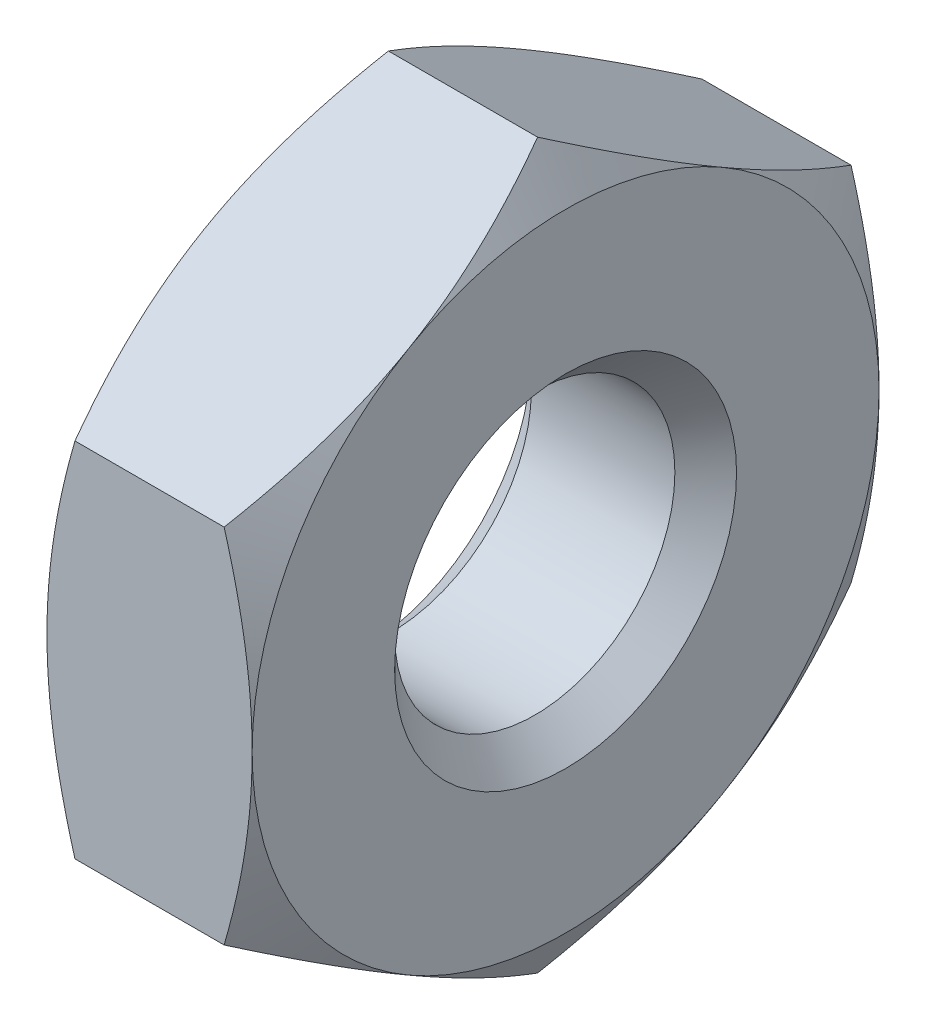
ISO-10303-21;
HEADER;
FILE_DESCRIPTION(('STEP AP214'),'2;1');
FILE_NAME('part.step','',(''),(''),'','','');
FILE_SCHEMA(('AUTOMOTIVE_DESIGN { 1 0 10303 214 1 1 1 1 }'));
ENDSEC;
DATA;
#1=APPLICATION_CONTEXT('core data for automotive mechanical design processes');
#2=APPLICATION_PROTOCOL_DEFINITION('international standard','automotive_design',2000,#1);
#3=PRODUCT_CONTEXT('',#1,'mechanical');
#4=PRODUCT('Part','Part','',(#3));
#5=PRODUCT_RELATED_PRODUCT_CATEGORY('part','',(#4));
#6=PRODUCT_DEFINITION_FORMATION('','',#4);
#7=PRODUCT_DEFINITION_CONTEXT('part definition',#1,'design');
#8=PRODUCT_DEFINITION('design','',#6,#7);
#9=PRODUCT_DEFINITION_SHAPE('','',#8);
#10=(LENGTH_UNIT() NAMED_UNIT(*) SI_UNIT(.MILLI.,.METRE.));
#11=(NAMED_UNIT(*) PLANE_ANGLE_UNIT() SI_UNIT($,.RADIAN.));
#12=(NAMED_UNIT(*) SI_UNIT($,.STERADIAN.) SOLID_ANGLE_UNIT());
#13=UNCERTAINTY_MEASURE_WITH_UNIT(LENGTH_MEASURE(1.E-05),#10,'distance_accuracy_value','');
#14=(GEOMETRIC_REPRESENTATION_CONTEXT(3) GLOBAL_UNCERTAINTY_ASSIGNED_CONTEXT((#13)) GLOBAL_UNIT_ASSIGNED_CONTEXT((#10,
#11,#12)) REPRESENTATION_CONTEXT('',''));
#15=CARTESIAN_POINT('',(0.,0.,0.));
#16=DIRECTION('',(0.,0.,1.));
#17=DIRECTION('',(1.,0.,0.));
#18=AXIS2_PLACEMENT_3D('',#15,#16,#17);
#19=CARTESIAN_POINT('',(-0.9,0.,0.));
#20=DIRECTION('',(1.,0.,0.));
#21=DIRECTION('',(0.,0.,-1.));
#22=AXIS2_PLACEMENT_3D('',#19,#20,#21);
#23=CONICAL_SURFACE('',#22,2.75,1.0471975511966);
#24=CARTESIAN_POINT('',(-0.65431323663524,-3.17554195059678,-0.0002));
#25=CARTESIAN_POINT('',(-0.694612337750737,-3.10576962051743,0.120649220659906));
#26=CARTESIAN_POINT('',(-0.731263097402338,-3.03539502097908,0.242541602622634));
#27=CARTESIAN_POINT('',(-0.7952378170302,-2.89342717394438,0.488437126727893));
#28=CARTESIAN_POINT('',(-0.822539144325503,-2.82183140359858,0.612444638573856));
#29=CARTESIAN_POINT('',(-0.865038254705884,-2.67952717191842,0.858922797975944));
#30=CARTESIAN_POINT('',(-0.880518881377543,-2.60884060771577,0.981355518587418));
#31=CARTESIAN_POINT('',(-0.89900060263006,-2.46713482015518,1.22679714236892));
#32=CARTESIAN_POINT('',(-0.902017000537401,-2.39611611197037,1.34980515323291));
#33=CARTESIAN_POINT('',(-0.895746854571454,-2.26341005486544,1.57965878661079));
#34=CARTESIAN_POINT('',(-0.887999845723298,-2.20170285541369,1.68653879125402));
#35=CARTESIAN_POINT('',(-0.863444818935646,-2.07869048467395,1.89960246733475));
#36=CARTESIAN_POINT('',(-0.84662841034943,-2.01738573896433,2.00578540164889));
#37=CARTESIAN_POINT('',(-0.804588077654044,-1.89411967378235,2.21928848939318));
#38=CARTESIAN_POINT('',(-0.779185919312769,-1.83217395817123,2.32658161614286));
#39=CARTESIAN_POINT('',(-0.721532774160018,-1.70920651275308,2.53956747928405));
#40=CARTESIAN_POINT('',(-0.689295336701017,-1.64818320715446,2.64526294502665));
#41=CARTESIAN_POINT('',(-0.65431323663524,-1.58759777021763,2.7502));
#42=B_SPLINE_CURVE_WITH_KNOTS('',3,(#24,#25,#26,#27,#28,#29,#30,#31,#32,#33,#34,#35,#36,#37,#38,
#39,#40,#41),.UNSPECIFIED.,.F.,.F.,(4,2,2,2,2,2,2,2,4),(0.,0.435912828725888,0.872873557116333,
1.29901931904672,1.72464171213574,2.09526089052938,2.46622354066374,2.84541551798557,
3.22386274754524),.UNSPECIFIED.);
#43=CARTESIAN_POINT('',(-0.9,-2.38156986040721,1.375));
#44=VERTEX_POINT('',#43);
#45=CARTESIAN_POINT('',(-0.654379906938137,-1.58771324027147,2.75));
#46=VERTEX_POINT('',#45);
#47=EDGE_CURVE('E103',#44,#46,#42,.T.);
#48=ORIENTED_EDGE('',*,*,#47,.T.);
#49=CARTESIAN_POINT('',(0.416899901263423,-4.21281764451437,2.75));
#50=CARTESIAN_POINT('',(0.358535815089788,-4.09206175441158,2.75));
#51=CARTESIAN_POINT('',(0.300751313320704,-3.97102058026671,2.75));
#52=CARTESIAN_POINT('',(0.186672627405725,-3.72821342104703,2.75));
#53=CARTESIAN_POINT('',(0.130378700829095,-3.60644731510045,2.75));
#54=CARTESIAN_POINT('',(0.0193161839189389,-3.36137924979038,2.75));
#55=CARTESIAN_POINT('',(-0.035441852528575,-3.23807249019035,2.75));
#56=CARTESIAN_POINT('',(-0.142608769416113,-2.99044622504903,2.75));
#57=CARTESIAN_POINT('',(-0.195017772139861,-2.86612677262459,2.75));
#58=CARTESIAN_POINT('',(-0.297488011111562,-2.61472491435784,2.75));
#59=CARTESIAN_POINT('',(-0.347512255717012,-2.4876273478228,2.75));
#60=CARTESIAN_POINT('',(-0.44364776901347,-2.23193378863612,2.75));
#61=CARTESIAN_POINT('',(-0.489758602600045,-2.10333763116978,2.75));
#62=CARTESIAN_POINT('',(-0.576829746324353,-1.84470576670703,2.75));
#63=CARTESIAN_POINT('',(-0.617800989357838,-1.71467377834623,2.75));
#64=CARTESIAN_POINT('',(-0.693263613623148,-1.45276113270945,2.75));
#65=CARTESIAN_POINT('',(-0.727757042007687,-1.32088107367669,2.75));
#66=CARTESIAN_POINT('',(-0.78859053449044,-1.05518302145174,2.75));
#67=CARTESIAN_POINT('',(-0.814928532417688,-0.921364546137649,2.75));
#68=CARTESIAN_POINT('',(-0.857679533738742,-0.652112000043977,2.75));
#69=CARTESIAN_POINT('',(-0.874092530509936,-0.516677928186429,2.75));
#70=CARTESIAN_POINT('',(-0.895541605643819,-0.245762022708403,2.75));
#71=CARTESIAN_POINT('',(-0.900649914519616,-0.110286056590155,2.75));
#72=CARTESIAN_POINT('',(-0.899217355491897,0.1605742701356,2.75));
#73=CARTESIAN_POINT('',(-0.892679521648765,0.295958645412542,2.75));
#74=CARTESIAN_POINT('',(-0.872036724800283,0.527085181886251,2.75));
#75=CARTESIAN_POINT('',(-0.860633397297106,0.623082191033753,2.75));
#76=CARTESIAN_POINT('',(-0.832711883051818,0.814335984804637,2.75));
#77=CARTESIAN_POINT('',(-0.816192891304295,0.90959265050686,2.75));
#78=CARTESIAN_POINT('',(-0.759829209833996,1.19417377130813,2.75));
#79=CARTESIAN_POINT('',(-0.71319228175913,1.38216583216317,2.75));
#80=CARTESIAN_POINT('',(-0.632739470552953,1.66347118298161,2.75));
#81=CARTESIAN_POINT('',(-0.60376150004185,1.75825036010037,2.75));
#82=CARTESIAN_POINT('',(-0.542933996229092,1.9468195257258,2.75));
#83=CARTESIAN_POINT('',(-0.511086441961622,2.04061014688646,2.75));
#84=CARTESIAN_POINT('',(-0.4451827949165,2.22681002484738,2.75));
#85=CARTESIAN_POINT('',(-0.411140134891263,2.31922408448836,2.75));
#86=CARTESIAN_POINT('',(-0.34105399005416,2.5033348377803,2.75));
#87=CARTESIAN_POINT('',(-0.305009698237778,2.59503122483462,2.75));
#88=CARTESIAN_POINT('',(-0.268162024521023,2.68639587514906,2.75));
#89=B_SPLINE_CURVE_WITH_KNOTS('',3,(#49,#50,#51,#52,#53,#54,#55,#56,#57,#58,#59,#60,#61,#62,#63,
#64,#65,#66,#67,#68,#69,#70,#71,#72,#73,#74,#75,#76,#77,#78,#79,#80,#81,#82,#83,#84,#85,#86,#87,
#88),.UNSPECIFIED.,.F.,.F.,(4,2,2,2,2,2,2,2,2,2,2,2,2,2,2,2,2,2,2,4),(0.,0.402367371635709,
0.804803823938378,1.20953982216093,1.61425472649941,2.02396821262994,2.43372719238479,
2.8425991975322,3.25134177057579,3.66018781361459,4.06903412946197,4.47526051498547,
4.88138108563411,5.17125535940099,5.46117527123615,6.04144588447769,6.33875257758382,
6.6358557773193,6.93128753464989,7.22683927936248),.UNSPECIFIED.);
#90=CARTESIAN_POINT('',(-0.9,0.,2.75));
#91=VERTEX_POINT('',#90);
#92=EDGE_CURVE('E130',#46,#91,#89,.T.);
#93=ORIENTED_EDGE('',*,*,#92,.T.);
#94=CARTESIAN_POINT('',(-0.9,0.,0.));
#95=DIRECTION('',(1.,0.,0.));
#96=DIRECTION('',(0.,0.,-1.));
#97=AXIS2_PLACEMENT_3D('',#94,#95,#96);
#98=CIRCLE('',#97,2.75);
#99=EDGE_CURVE('E125',#91,#44,#98,.T.);
#100=ORIENTED_EDGE('',*,*,#99,.T.);
#101=EDGE_LOOP('',(#48,#93,#100));
#102=FACE_BOUND('',#101,.T.);
#103=ADVANCED_FACE('F16',(#102),#23,.T.);
#104=CARTESIAN_POINT('',(-0.9,2.38156986040721,1.375));
#105=VERTEX_POINT('',#104);
#106=EDGE_CURVE('E24',#105,#91,#98,.T.);
#107=ORIENTED_EDGE('',*,*,#106,.T.);
#108=CARTESIAN_POINT('',(-0.654379906938138,1.58771324027147,2.75));
#109=VERTEX_POINT('',#108);
#110=EDGE_CURVE('E135',#91,#109,#89,.T.);
#111=ORIENTED_EDGE('',*,*,#110,.T.);
#112=CARTESIAN_POINT('',(-0.654313236635239,1.58759777021763,2.7502));
#113=CARTESIAN_POINT('',(-0.694612337750736,1.65737010029699,2.62935077934009));
#114=CARTESIAN_POINT('',(-0.731263097402338,1.72774469983533,2.50745839737737));
#115=CARTESIAN_POINT('',(-0.795237817030199,1.86971254687003,2.26156287327211));
#116=CARTESIAN_POINT('',(-0.822539144325503,1.94130831721583,2.13755536142614));
#117=CARTESIAN_POINT('',(-0.865038254705884,2.08361254889599,1.89107720202406));
#118=CARTESIAN_POINT('',(-0.880518881377543,2.15429911309864,1.76864448141258));
#119=CARTESIAN_POINT('',(-0.89900060263006,2.29600490065923,1.52320285763108));
#120=CARTESIAN_POINT('',(-0.902017000537401,2.36702360884404,1.40019484676709));
#121=CARTESIAN_POINT('',(-0.895746854571454,2.49972966594897,1.17034121338921));
#122=CARTESIAN_POINT('',(-0.887999845723298,2.56143686540073,1.06346120874598));
#123=CARTESIAN_POINT('',(-0.863444818935645,2.68444923614047,0.85039753266525));
#124=CARTESIAN_POINT('',(-0.84662841034943,2.74575398185008,0.74421459835111));
#125=CARTESIAN_POINT('',(-0.804588077654044,2.86902004703206,0.530711510606816));
#126=CARTESIAN_POINT('',(-0.779185919312769,2.93096576264318,0.423418383857145));
#127=CARTESIAN_POINT('',(-0.721532774160018,3.05393320806134,0.210432520715949));
#128=CARTESIAN_POINT('',(-0.689295336701018,3.11495651365995,0.104737054973347));
#129=CARTESIAN_POINT('',(-0.65431323663524,3.17554195059678,-0.000200000000000238));
#130=B_SPLINE_CURVE_WITH_KNOTS('',3,(#112,#113,#114,#115,#116,#117,#118,#119,#120,#121,#122,
#123,#124,#125,#126,#127,#128,#129),.UNSPECIFIED.,.F.,.F.,(4,2,2,2,2,2,2,2,4),(0.,
0.435912828725888,0.872873557116333,1.29901931904672,1.72464171213574,2.09526089052938,
2.46622354066374,2.84541551798557,3.22386274754524),.UNSPECIFIED.);
#131=EDGE_CURVE('E136',#109,#105,#130,.T.);
#132=ORIENTED_EDGE('',*,*,#131,.T.);
#133=EDGE_LOOP('',(#107,#111,#132));
#134=FACE_BOUND('',#133,.T.);
#135=ADVANCED_FACE('F134',(#134),#23,.T.);
#136=CARTESIAN_POINT('',(-0.65431323663524,3.17554195059678,0.0002));
#137=CARTESIAN_POINT('',(-0.694612337750737,3.10576962051743,-0.120649220659906));
#138=CARTESIAN_POINT('',(-0.731263097402338,3.03539502097908,-0.242541602622634));
#139=CARTESIAN_POINT('',(-0.7952378170302,2.89342717394438,-0.488437126727893));
#140=CARTESIAN_POINT('',(-0.822539144325503,2.82183140359858,-0.612444638573856));
#141=CARTESIAN_POINT('',(-0.865038254705884,2.67952717191842,-0.858922797975944));
#142=CARTESIAN_POINT('',(-0.880518881377543,2.60884060771577,-0.981355518587418));
#143=CARTESIAN_POINT('',(-0.89900060263006,2.46713482015518,-1.22679714236892));
#144=CARTESIAN_POINT('',(-0.902017000537401,2.39611611197037,-1.34980515323291));
#145=CARTESIAN_POINT('',(-0.895746854571454,2.26341005486544,-1.57965878661079));
#146=CARTESIAN_POINT('',(-0.887999845723298,2.20170285541369,-1.68653879125402));
#147=CARTESIAN_POINT('',(-0.863444818935646,2.07869048467395,-1.89960246733475));
#148=CARTESIAN_POINT('',(-0.84662841034943,2.01738573896433,-2.00578540164889));
#149=CARTESIAN_POINT('',(-0.804588077654044,1.89411967378235,-2.21928848939318));
#150=CARTESIAN_POINT('',(-0.779185919312769,1.83217395817123,-2.32658161614286));
#151=CARTESIAN_POINT('',(-0.721532774160018,1.70920651275308,-2.53956747928405));
#152=CARTESIAN_POINT('',(-0.689295336701017,1.64818320715446,-2.64526294502665));
#153=CARTESIAN_POINT('',(-0.65431323663524,1.58759777021763,-2.7502));
#154=B_SPLINE_CURVE_WITH_KNOTS('',3,(#136,#137,#138,#139,#140,#141,#142,#143,#144,#145,#146,
#147,#148,#149,#150,#151,#152,#153),.UNSPECIFIED.,.F.,.F.,(4,2,2,2,2,2,2,2,4),(0.,
0.435912828725888,0.872873557116333,1.29901931904672,1.72464171213574,2.09526089052938,
2.46622354066374,2.84541551798557,3.22386274754524),.UNSPECIFIED.);
#155=CARTESIAN_POINT('',(-0.654379906938138,3.17542648054294,0.));
#156=VERTEX_POINT('',#155);
#157=CARTESIAN_POINT('',(-0.9,2.38156986040721,-1.375));
#158=VERTEX_POINT('',#157);
#159=EDGE_CURVE('E143',#156,#158,#154,.T.);
#160=ORIENTED_EDGE('',*,*,#159,.T.);
#161=EDGE_CURVE('E11',#158,#105,#98,.T.);
#162=ORIENTED_EDGE('',*,*,#161,.T.);
#163=EDGE_CURVE('E142',#105,#156,#130,.T.);
#164=ORIENTED_EDGE('',*,*,#163,.T.);
#165=EDGE_LOOP('',(#160,#162,#164));
#166=FACE_BOUND('',#165,.T.);
#167=ADVANCED_FACE('F141',(#166),#23,.T.);
#168=CARTESIAN_POINT('',(-0.9,0.,-2.75));
#169=VERTEX_POINT('',#168);
#170=EDGE_CURVE('E25',#169,#158,#98,.T.);
#171=ORIENTED_EDGE('',*,*,#170,.T.);
#172=CARTESIAN_POINT('',(-0.654379906938138,1.58771324027147,-2.75));
#173=VERTEX_POINT('',#172);
#174=EDGE_CURVE('E149',#158,#173,#154,.T.);
#175=ORIENTED_EDGE('',*,*,#174,.T.);
#176=CARTESIAN_POINT('',(0.416899901263423,-4.21281764451437,-2.75));
#177=CARTESIAN_POINT('',(0.358535815089788,-4.09206175441158,-2.75));
#178=CARTESIAN_POINT('',(0.300751313320704,-3.97102058026671,-2.75));
#179=CARTESIAN_POINT('',(0.186672627405725,-3.72821342104703,-2.75));
#180=CARTESIAN_POINT('',(0.130378700829095,-3.60644731510045,-2.75));
#181=CARTESIAN_POINT('',(0.0193161839189389,-3.36137924979038,-2.75));
#182=CARTESIAN_POINT('',(-0.035441852528575,-3.23807249019035,-2.75));
#183=CARTESIAN_POINT('',(-0.142608769416113,-2.99044622504903,-2.75));
#184=CARTESIAN_POINT('',(-0.195017772139861,-2.86612677262459,-2.75));
#185=CARTESIAN_POINT('',(-0.297488011111562,-2.61472491435784,-2.75));
#186=CARTESIAN_POINT('',(-0.347512255717012,-2.4876273478228,-2.75));
#187=CARTESIAN_POINT('',(-0.44364776901347,-2.23193378863612,-2.75));
#188=CARTESIAN_POINT('',(-0.489758602600045,-2.10333763116978,-2.75));
#189=CARTESIAN_POINT('',(-0.576829746324353,-1.84470576670703,-2.75));
#190=CARTESIAN_POINT('',(-0.617800989357838,-1.71467377834623,-2.75));
#191=CARTESIAN_POINT('',(-0.693263613623148,-1.45276113270945,-2.75));
#192=CARTESIAN_POINT('',(-0.727757042007687,-1.32088107367669,-2.75));
#193=CARTESIAN_POINT('',(-0.78859053449044,-1.05518302145174,-2.75));
#194=CARTESIAN_POINT('',(-0.814928532417688,-0.921364546137649,-2.75));
#195=CARTESIAN_POINT('',(-0.857679533738742,-0.652112000043977,-2.75));
#196=CARTESIAN_POINT('',(-0.874092530509936,-0.516677928186429,-2.75));
#197=CARTESIAN_POINT('',(-0.895541605643819,-0.245762022708403,-2.75));
#198=CARTESIAN_POINT('',(-0.900649914519616,-0.110286056590155,-2.75));
#199=CARTESIAN_POINT('',(-0.899217355491897,0.1605742701356,-2.75));
#200=CARTESIAN_POINT('',(-0.892679521648765,0.295958645412542,-2.75));
#201=CARTESIAN_POINT('',(-0.872036724800283,0.527085181886251,-2.75));
#202=CARTESIAN_POINT('',(-0.860633397297106,0.623082191033753,-2.75));
#203=CARTESIAN_POINT('',(-0.832711883051818,0.814335984804637,-2.75));
#204=CARTESIAN_POINT('',(-0.816192891304295,0.90959265050686,-2.75));
#205=CARTESIAN_POINT('',(-0.759829209833996,1.19417377130813,-2.75));
#206=CARTESIAN_POINT('',(-0.71319228175913,1.38216583216317,-2.75));
#207=CARTESIAN_POINT('',(-0.632739470552953,1.66347118298161,-2.75));
#208=CARTESIAN_POINT('',(-0.60376150004185,1.75825036010037,-2.75));
#209=CARTESIAN_POINT('',(-0.542933996229092,1.9468195257258,-2.75));
#210=CARTESIAN_POINT('',(-0.511086441961622,2.04061014688646,-2.75));
#211=CARTESIAN_POINT('',(-0.4451827949165,2.22681002484738,-2.75));
#212=CARTESIAN_POINT('',(-0.411140134891263,2.31922408448836,-2.75));
#213=CARTESIAN_POINT('',(-0.34105399005416,2.5033348377803,-2.75));
#214=CARTESIAN_POINT('',(-0.305009698237778,2.59503122483462,-2.75));
#215=CARTESIAN_POINT('',(-0.268162024521023,2.68639587514906,-2.75));
#216=B_SPLINE_CURVE_WITH_KNOTS('',3,(#176,#177,#178,#179,#180,#181,#182,#183,#184,#185,#186,
#187,#188,#189,#190,#191,#192,#193,#194,#195,#196,#197,#198,#199,#200,#201,#202,#203,#204,#205,
#206,#207,#208,#209,#210,#211,#212,#213,#214,#215),.UNSPECIFIED.,.F.,.F.,(4,2,2,2,2,2,2,2,2,2,2,
2,2,2,2,2,2,2,2,4),(0.,0.402367371635709,0.804803823938378,1.20953982216093,1.61425472649941,
2.02396821262994,2.43372719238479,2.8425991975322,3.25134177057579,3.66018781361459,
4.06903412946197,4.47526051498547,4.88138108563411,5.17125535940099,5.46117527123615,
6.04144588447769,6.33875257758382,6.6358557773193,6.93128753464989,7.22683927936248),.UNSPECIFIED.);
#217=EDGE_CURVE('E155',#173,#169,#216,.F.);
#218=ORIENTED_EDGE('',*,*,#217,.T.);
#219=EDGE_LOOP('',(#171,#175,#218));
#220=FACE_BOUND('',#219,.T.);
#221=ADVANCED_FACE('F154',(#220),#23,.T.);
#222=CARTESIAN_POINT('',(-0.9,-2.38156986040721,-1.375));
#223=VERTEX_POINT('',#222);
#224=EDGE_CURVE('E129',#223,#169,#98,.T.);
#225=ORIENTED_EDGE('',*,*,#224,.T.);
#226=CARTESIAN_POINT('',(-0.654379906938138,-1.58771324027147,-2.75));
#227=VERTEX_POINT('',#226);
#228=EDGE_CURVE('E309',#169,#227,#216,.F.);
#229=ORIENTED_EDGE('',*,*,#228,.T.);
#230=CARTESIAN_POINT('',(-0.654313236635239,-1.58759777021763,-2.7502));
#231=CARTESIAN_POINT('',(-0.694612337750736,-1.65737010029699,-2.62935077934009));
#232=CARTESIAN_POINT('',(-0.731263097402338,-1.72774469983533,-2.50745839737737));
#233=CARTESIAN_POINT('',(-0.795237817030199,-1.86971254687003,-2.26156287327211));
#234=CARTESIAN_POINT('',(-0.822539144325503,-1.94130831721583,-2.13755536142614));
#235=CARTESIAN_POINT('',(-0.865038254705884,-2.08361254889599,-1.89107720202406));
#236=CARTESIAN_POINT('',(-0.880518881377543,-2.15429911309864,-1.76864448141258));
#237=CARTESIAN_POINT('',(-0.89900060263006,-2.29600490065923,-1.52320285763108));
#238=CARTESIAN_POINT('',(-0.902017000537401,-2.36702360884404,-1.40019484676709));
#239=CARTESIAN_POINT('',(-0.895746854571454,-2.49972966594897,-1.17034121338921));
#240=CARTESIAN_POINT('',(-0.887999845723298,-2.56143686540073,-1.06346120874598));
#241=CARTESIAN_POINT('',(-0.863444818935645,-2.68444923614047,-0.85039753266525));
#242=CARTESIAN_POINT('',(-0.84662841034943,-2.74575398185008,-0.74421459835111));
#243=CARTESIAN_POINT('',(-0.804588077654044,-2.86902004703206,-0.530711510606816));
#244=CARTESIAN_POINT('',(-0.779185919312769,-2.93096576264318,-0.423418383857145));
#245=CARTESIAN_POINT('',(-0.721532774160018,-3.05393320806134,-0.210432520715949));
#246=CARTESIAN_POINT('',(-0.689295336701018,-3.11495651365995,-0.104737054973347));
#247=CARTESIAN_POINT('',(-0.65431323663524,-3.17554195059678,0.000200000000000238));
#248=B_SPLINE_CURVE_WITH_KNOTS('',3,(#230,#231,#232,#233,#234,#235,#236,#237,#238,#239,#240,
#241,#242,#243,#244,#245,#246,#247),.UNSPECIFIED.,.F.,.F.,(4,2,2,2,2,2,2,2,4),(0.,
0.435912828725888,0.872873557116333,1.29901931904672,1.72464171213574,2.09526089052938,
2.46622354066374,2.84541551798557,3.22386274754524),.UNSPECIFIED.);
#249=EDGE_CURVE('E310',#227,#223,#248,.T.);
#250=ORIENTED_EDGE('',*,*,#249,.T.);
#251=EDGE_LOOP('',(#225,#229,#250));
#252=FACE_BOUND('',#251,.T.);
#253=ADVANCED_FACE('F295',(#252),#23,.T.);
#254=CARTESIAN_POINT('',(0.640192378864669,0.,0.));
#255=DIRECTION('',(-1.,0.,0.));
#256=DIRECTION('',(0.,0.,1.));
#257=AXIS2_PLACEMENT_3D('',#254,#255,#256);
#258=CONICAL_SURFACE('',#257,3.2,1.0471975511966);
#259=CARTESIAN_POINT('',(-0.416899901263421,-4.21281764451437,-2.75));
#260=CARTESIAN_POINT('',(-0.358535815089786,-4.09206175441158,-2.75));
#261=CARTESIAN_POINT('',(-0.300751313320702,-3.97102058026671,-2.75));
#262=CARTESIAN_POINT('',(-0.186672627405723,-3.72821342104703,-2.75));
#263=CARTESIAN_POINT('',(-0.130378700829094,-3.60644731510045,-2.75));
#264=CARTESIAN_POINT('',(-0.0193161839189375,-3.36137924979038,-2.75));
#265=CARTESIAN_POINT('',(0.0354418525285759,-3.23807249019035,-2.75));
#266=CARTESIAN_POINT('',(0.142608769416113,-2.99044622504903,-2.75));
#267=CARTESIAN_POINT('',(0.195017772139862,-2.86612677262459,-2.75));
#268=CARTESIAN_POINT('',(0.297488011111563,-2.61472491435784,-2.75));
#269=CARTESIAN_POINT('',(0.347512255717013,-2.4876273478228,-2.75));
#270=CARTESIAN_POINT('',(0.443647769013471,-2.23193378863612,-2.75));
#271=CARTESIAN_POINT('',(0.489758602600045,-2.10333763116978,-2.75));
#272=CARTESIAN_POINT('',(0.576829746324353,-1.84470576670703,-2.75));
#273=CARTESIAN_POINT('',(0.617800989357838,-1.71467377834623,-2.75));
#274=CARTESIAN_POINT('',(0.693263613623148,-1.45276113270946,-2.75));
#275=CARTESIAN_POINT('',(0.727757042007687,-1.32088107367669,-2.75));
#276=CARTESIAN_POINT('',(0.78859053449044,-1.05518302145174,-2.75));
#277=CARTESIAN_POINT('',(0.814928532417688,-0.921364546137649,-2.75));
#278=CARTESIAN_POINT('',(0.857679533738741,-0.652112000043978,-2.75));
#279=CARTESIAN_POINT('',(0.874092530509936,-0.51667792818643,-2.75));
#280=CARTESIAN_POINT('',(0.895541605643819,-0.245762022708404,-2.75));
#281=CARTESIAN_POINT('',(0.900649914519616,-0.110286056590156,-2.75));
#282=CARTESIAN_POINT('',(0.899217355491897,0.160574270135599,-2.75));
#283=CARTESIAN_POINT('',(0.892679521648765,0.295958645412542,-2.75));
#284=CARTESIAN_POINT('',(0.872036724800283,0.527085181886251,-2.75));
#285=CARTESIAN_POINT('',(0.860633397297106,0.623082191033753,-2.75));
#286=CARTESIAN_POINT('',(0.832711883051818,0.814335984804638,-2.75));
#287=CARTESIAN_POINT('',(0.816192891304295,0.909592650506861,-2.75));
#288=CARTESIAN_POINT('',(0.759829209833996,1.19417377130813,-2.75));
#289=CARTESIAN_POINT('',(0.71319228175913,1.38216583216317,-2.75));
#290=CARTESIAN_POINT('',(0.632739470552953,1.66347118298161,-2.75));
#291=CARTESIAN_POINT('',(0.60376150004185,1.75825036010037,-2.75));
#292=CARTESIAN_POINT('',(0.542933996229092,1.9468195257258,-2.75));
#293=CARTESIAN_POINT('',(0.511086441961621,2.04061014688646,-2.75));
#294=CARTESIAN_POINT('',(0.445182794916499,2.22681002484738,-2.75));
#295=CARTESIAN_POINT('',(0.411140134891263,2.31922408448836,-2.75));
#296=CARTESIAN_POINT('',(0.341053990054159,2.50333483778031,-2.75));
#297=CARTESIAN_POINT('',(0.305009698237777,2.59503122483463,-2.75));
#298=CARTESIAN_POINT('',(0.268162024521022,2.68639587514906,-2.75));
#299=B_SPLINE_CURVE_WITH_KNOTS('',3,(#259,#260,#261,#262,#263,#264,#265,#266,#267,#268,#269,
#270,#271,#272,#273,#274,#275,#276,#277,#278,#279,#280,#281,#282,#283,#284,#285,#286,#287,#288,
#289,#290,#291,#292,#293,#294,#295,#296,#297,#298),.UNSPECIFIED.,.F.,.F.,(4,2,2,2,2,2,2,2,2,2,2,
2,2,2,2,2,2,2,2,4),(0.,0.402367371635709,0.804803823938378,1.20953982216093,1.61425472649941,
2.02396821262994,2.43372719238479,2.8425991975322,3.25134177057579,3.66018781361459,
4.06903412946197,4.47526051498547,4.88138108563411,5.17125535940099,5.46117527123615,
6.04144588447769,6.33875257758382,6.6358557773193,6.93128753464989,7.22683927936248),.UNSPECIFIED.);
#300=CARTESIAN_POINT('',(0.9,0.,-2.75));
#301=VERTEX_POINT('',#300);
#302=CARTESIAN_POINT('',(0.654379906938138,1.58771324027147,-2.75));
#303=VERTEX_POINT('',#302);
#304=EDGE_CURVE('E313',#301,#303,#299,.T.);
#305=ORIENTED_EDGE('',*,*,#304,.T.);
#306=CARTESIAN_POINT('',(0.65431323663524,1.58759777021763,-2.7502));
#307=CARTESIAN_POINT('',(0.694612337750737,1.65737010029699,-2.62935077934009));
#308=CARTESIAN_POINT('',(0.731263097402338,1.72774469983533,-2.50745839737737));
#309=CARTESIAN_POINT('',(0.7952378170302,1.86971254687003,-2.26156287327211));
#310=CARTESIAN_POINT('',(0.822539144325503,1.94130831721583,-2.13755536142614));
#311=CARTESIAN_POINT('',(0.865038254705884,2.08361254889599,-1.89107720202406));
#312=CARTESIAN_POINT('',(0.880518881377543,2.15429911309864,-1.76864448141258));
#313=CARTESIAN_POINT('',(0.89900060263006,2.29600490065923,-1.52320285763108));
#314=CARTESIAN_POINT('',(0.902017000537401,2.36702360884404,-1.40019484676709));
#315=CARTESIAN_POINT('',(0.895746854571454,2.49972966594897,-1.17034121338921));
#316=CARTESIAN_POINT('',(0.887999845723298,2.56143686540073,-1.06346120874598));
#317=CARTESIAN_POINT('',(0.863444818935646,2.68444923614047,-0.85039753266525));
#318=CARTESIAN_POINT('',(0.84662841034943,2.74575398185008,-0.74421459835111));
#319=CARTESIAN_POINT('',(0.804588077654044,2.86902004703206,-0.530711510606816));
#320=CARTESIAN_POINT('',(0.77918591931277,2.93096576264318,-0.423418383857145));
#321=CARTESIAN_POINT('',(0.721532774160019,3.05393320806134,-0.210432520715949));
#322=CARTESIAN_POINT('',(0.689295336701018,3.11495651365995,-0.104737054973348));
#323=CARTESIAN_POINT('',(0.65431323663524,3.17554195059678,0.000200000000000086));
#324=B_SPLINE_CURVE_WITH_KNOTS('',3,(#306,#307,#308,#309,#310,#311,#312,#313,#314,#315,#316,
#317,#318,#319,#320,#321,#322,#323),.UNSPECIFIED.,.F.,.F.,(4,2,2,2,2,2,2,2,4),(0.,
0.435912828725889,0.872873557116333,1.29901931904672,1.72464171213574,2.09526089052938,
2.46622354066374,2.84541551798557,3.22386274754524),.UNSPECIFIED.);
#325=CARTESIAN_POINT('',(0.9,2.38156986040721,-1.375));
#326=VERTEX_POINT('',#325);
#327=EDGE_CURVE('E349',#303,#326,#324,.T.);
#328=ORIENTED_EDGE('',*,*,#327,.T.);
#329=CARTESIAN_POINT('',(0.9,0.,0.));
#330=DIRECTION('',(1.,0.,0.));
#331=DIRECTION('',(0.,0.,-1.));
#332=AXIS2_PLACEMENT_3D('',#329,#330,#331);
#333=CIRCLE('',#332,2.75);
#334=EDGE_CURVE('E159',#301,#326,#333,.T.);
#335=ORIENTED_EDGE('',*,*,#334,.F.);
#336=EDGE_LOOP('',(#305,#328,#335));
#337=FACE_BOUND('',#336,.T.);
#338=ADVANCED_FACE('F287',(#337),#258,.T.);
#339=CARTESIAN_POINT('',(0.9,2.38156986040721,1.375));
#340=VERTEX_POINT('',#339);
#341=EDGE_CURVE('E156',#326,#340,#333,.T.);
#342=ORIENTED_EDGE('',*,*,#341,.F.);
#343=CARTESIAN_POINT('',(0.654379906938138,3.17542648054294,0.));
#344=VERTEX_POINT('',#343);
#345=EDGE_CURVE('E357',#326,#344,#324,.T.);
#346=ORIENTED_EDGE('',*,*,#345,.T.);
#347=CARTESIAN_POINT('',(0.65431323663524,3.17554195059678,-0.000200000000000039));
#348=CARTESIAN_POINT('',(0.694612337750737,3.10576962051743,0.120649220659906));
#349=CARTESIAN_POINT('',(0.731263097402338,3.03539502097908,0.242541602622634));
#350=CARTESIAN_POINT('',(0.7952378170302,2.89342717394439,0.488437126727893));
#351=CARTESIAN_POINT('',(0.822539144325503,2.82183140359858,0.612444638573856));
#352=CARTESIAN_POINT('',(0.865038254705884,2.67952717191842,0.858922797975945));
#353=CARTESIAN_POINT('',(0.880518881377543,2.60884060771577,0.981355518587418));
#354=CARTESIAN_POINT('',(0.89900060263006,2.46713482015518,1.22679714236892));
#355=CARTESIAN_POINT('',(0.902017000537401,2.39611611197037,1.34980515323291));
#356=CARTESIAN_POINT('',(0.895746854571454,2.26341005486544,1.57965878661079));
#357=CARTESIAN_POINT('',(0.887999845723298,2.20170285541369,1.68653879125402));
#358=CARTESIAN_POINT('',(0.863444818935645,2.07869048467395,1.89960246733475));
#359=CARTESIAN_POINT('',(0.84662841034943,2.01738573896433,2.00578540164889));
#360=CARTESIAN_POINT('',(0.804588077654044,1.89411967378235,2.21928848939318));
#361=CARTESIAN_POINT('',(0.779185919312769,1.83217395817123,2.32658161614286));
#362=CARTESIAN_POINT('',(0.721532774160018,1.70920651275308,2.53956747928405));
#363=CARTESIAN_POINT('',(0.689295336701018,1.64818320715446,2.64526294502665));
#364=CARTESIAN_POINT('',(0.65431323663524,1.58759777021763,2.7502));
#365=B_SPLINE_CURVE_WITH_KNOTS('',3,(#347,#348,#349,#350,#351,#352,#353,#354,#355,#356,#357,
#358,#359,#360,#361,#362,#363,#364),.UNSPECIFIED.,.F.,.F.,(4,2,2,2,2,2,2,2,4),(0.,
0.435912828725889,0.872873557116333,1.29901931904672,1.72464171213574,2.09526089052938,
2.46622354066374,2.84541551798557,3.22386274754524),.UNSPECIFIED.);
#366=EDGE_CURVE('E222',#344,#340,#365,.T.);
#367=ORIENTED_EDGE('',*,*,#366,.T.);
#368=EDGE_LOOP('',(#342,#346,#367));
#369=FACE_BOUND('',#368,.T.);
#370=ADVANCED_FACE('F305',(#369),#258,.T.);
#371=CARTESIAN_POINT('',(0.9,0.,2.75));
#372=VERTEX_POINT('',#371);
#373=EDGE_CURVE('E158',#340,#372,#333,.T.);
#374=ORIENTED_EDGE('',*,*,#373,.F.);
#375=CARTESIAN_POINT('',(0.654379906938138,1.58771324027147,2.75));
#376=VERTEX_POINT('',#375);
#377=EDGE_CURVE('E148',#340,#376,#365,.T.);
#378=ORIENTED_EDGE('',*,*,#377,.T.);
#379=CARTESIAN_POINT('',(-0.416899901263421,-4.21281764451437,2.75));
#380=CARTESIAN_POINT('',(-0.358535815089786,-4.09206175441158,2.75));
#381=CARTESIAN_POINT('',(-0.300751313320702,-3.97102058026671,2.75));
#382=CARTESIAN_POINT('',(-0.186672627405723,-3.72821342104703,2.75));
#383=CARTESIAN_POINT('',(-0.130378700829094,-3.60644731510045,2.75));
#384=CARTESIAN_POINT('',(-0.0193161839189375,-3.36137924979038,2.75));
#385=CARTESIAN_POINT('',(0.0354418525285759,-3.23807249019035,2.75));
#386=CARTESIAN_POINT('',(0.142608769416113,-2.99044622504903,2.75));
#387=CARTESIAN_POINT('',(0.195017772139862,-2.86612677262459,2.75));
#388=CARTESIAN_POINT('',(0.297488011111563,-2.61472491435784,2.75));
#389=CARTESIAN_POINT('',(0.347512255717013,-2.4876273478228,2.75));
#390=CARTESIAN_POINT('',(0.443647769013471,-2.23193378863612,2.75));
#391=CARTESIAN_POINT('',(0.489758602600045,-2.10333763116978,2.75));
#392=CARTESIAN_POINT('',(0.576829746324353,-1.84470576670703,2.75));
#393=CARTESIAN_POINT('',(0.617800989357838,-1.71467377834623,2.75));
#394=CARTESIAN_POINT('',(0.693263613623148,-1.45276113270946,2.75));
#395=CARTESIAN_POINT('',(0.727757042007687,-1.32088107367669,2.75));
#396=CARTESIAN_POINT('',(0.78859053449044,-1.05518302145174,2.75));
#397=CARTESIAN_POINT('',(0.814928532417688,-0.921364546137649,2.75));
#398=CARTESIAN_POINT('',(0.857679533738741,-0.652112000043978,2.75));
#399=CARTESIAN_POINT('',(0.874092530509936,-0.51667792818643,2.75));
#400=CARTESIAN_POINT('',(0.895541605643819,-0.245762022708404,2.75));
#401=CARTESIAN_POINT('',(0.900649914519616,-0.110286056590156,2.75));
#402=CARTESIAN_POINT('',(0.899217355491897,0.160574270135599,2.75));
#403=CARTESIAN_POINT('',(0.892679521648765,0.295958645412542,2.75));
#404=CARTESIAN_POINT('',(0.872036724800283,0.527085181886251,2.75));
#405=CARTESIAN_POINT('',(0.860633397297106,0.623082191033753,2.75));
#406=CARTESIAN_POINT('',(0.832711883051818,0.814335984804638,2.75));
#407=CARTESIAN_POINT('',(0.816192891304295,0.909592650506861,2.75));
#408=CARTESIAN_POINT('',(0.759829209833996,1.19417377130813,2.75));
#409=CARTESIAN_POINT('',(0.71319228175913,1.38216583216317,2.75));
#410=CARTESIAN_POINT('',(0.632739470552953,1.66347118298161,2.75));
#411=CARTESIAN_POINT('',(0.60376150004185,1.75825036010037,2.75));
#412=CARTESIAN_POINT('',(0.542933996229092,1.9468195257258,2.75));
#413=CARTESIAN_POINT('',(0.511086441961621,2.04061014688646,2.75));
#414=CARTESIAN_POINT('',(0.445182794916499,2.22681002484738,2.75));
#415=CARTESIAN_POINT('',(0.411140134891263,2.31922408448836,2.75));
#416=CARTESIAN_POINT('',(0.341053990054159,2.50333483778031,2.75));
#417=CARTESIAN_POINT('',(0.305009698237777,2.59503122483463,2.75));
#418=CARTESIAN_POINT('',(0.268162024521022,2.68639587514906,2.75));
#419=B_SPLINE_CURVE_WITH_KNOTS('',3,(#379,#380,#381,#382,#383,#384,#385,#386,#387,#388,#389,
#390,#391,#392,#393,#394,#395,#396,#397,#398,#399,#400,#401,#402,#403,#404,#405,#406,#407,#408,
#409,#410,#411,#412,#413,#414,#415,#416,#417,#418),.UNSPECIFIED.,.F.,.F.,(4,2,2,2,2,2,2,2,2,2,2,
2,2,2,2,2,2,2,2,4),(0.,0.402367371635709,0.804803823938378,1.20953982216093,1.61425472649941,
2.02396821262994,2.43372719238479,2.8425991975322,3.25134177057579,3.66018781361459,
4.06903412946197,4.47526051498547,4.88138108563411,5.17125535940099,5.46117527123615,
6.04144588447769,6.33875257758382,6.6358557773193,6.93128753464989,7.22683927936248),.UNSPECIFIED.);
#420=EDGE_CURVE('E188',#376,#372,#419,.F.);
#421=ORIENTED_EDGE('',*,*,#420,.T.);
#422=EDGE_LOOP('',(#374,#378,#421));
#423=FACE_BOUND('',#422,.T.);
#424=ADVANCED_FACE('F230',(#423),#258,.T.);
#425=CARTESIAN_POINT('',(0.65431323663524,-3.17554195059678,0.000200000000000039));
#426=CARTESIAN_POINT('',(0.694612337750737,-3.10576962051743,-0.120649220659906));
#427=CARTESIAN_POINT('',(0.731263097402338,-3.03539502097908,-0.242541602622634));
#428=CARTESIAN_POINT('',(0.7952378170302,-2.89342717394439,-0.488437126727893));
#429=CARTESIAN_POINT('',(0.822539144325503,-2.82183140359858,-0.612444638573856));
#430=CARTESIAN_POINT('',(0.865038254705884,-2.67952717191842,-0.858922797975945));
#431=CARTESIAN_POINT('',(0.880518881377543,-2.60884060771577,-0.981355518587418));
#432=CARTESIAN_POINT('',(0.89900060263006,-2.46713482015518,-1.22679714236892));
#433=CARTESIAN_POINT('',(0.902017000537401,-2.39611611197037,-1.34980515323291));
#434=CARTESIAN_POINT('',(0.895746854571454,-2.26341005486544,-1.57965878661079));
#435=CARTESIAN_POINT('',(0.887999845723298,-2.20170285541369,-1.68653879125402));
#436=CARTESIAN_POINT('',(0.863444818935645,-2.07869048467395,-1.89960246733475));
#437=CARTESIAN_POINT('',(0.84662841034943,-2.01738573896433,-2.00578540164889));
#438=CARTESIAN_POINT('',(0.804588077654044,-1.89411967378235,-2.21928848939318));
#439=CARTESIAN_POINT('',(0.779185919312769,-1.83217395817123,-2.32658161614286));
#440=CARTESIAN_POINT('',(0.721532774160018,-1.70920651275308,-2.53956747928405));
#441=CARTESIAN_POINT('',(0.689295336701018,-1.64818320715446,-2.64526294502665));
#442=CARTESIAN_POINT('',(0.65431323663524,-1.58759777021763,-2.7502));
#443=B_SPLINE_CURVE_WITH_KNOTS('',3,(#425,#426,#427,#428,#429,#430,#431,#432,#433,#434,#435,
#436,#437,#438,#439,#440,#441,#442),.UNSPECIFIED.,.F.,.F.,(4,2,2,2,2,2,2,2,4),(0.,
0.435912828725889,0.872873557116333,1.29901931904672,1.72464171213574,2.09526089052938,
2.46622354066374,2.84541551798557,3.22386274754524),.UNSPECIFIED.);
#444=CARTESIAN_POINT('',(0.9,-2.38156986040721,-1.375));
#445=VERTEX_POINT('',#444);
#446=CARTESIAN_POINT('',(0.654379906938138,-1.58771324027147,-2.75));
#447=VERTEX_POINT('',#446);
#448=EDGE_CURVE('E119',#445,#447,#443,.T.);
#449=ORIENTED_EDGE('',*,*,#448,.T.);
#450=EDGE_CURVE('E316',#447,#301,#299,.T.);
#451=ORIENTED_EDGE('',*,*,#450,.T.);
#452=EDGE_CURVE('E165',#445,#301,#333,.T.);
#453=ORIENTED_EDGE('',*,*,#452,.F.);
#454=EDGE_LOOP('',(#449,#451,#453));
#455=FACE_BOUND('',#454,.T.);
#456=ADVANCED_FACE('F356',(#455),#258,.T.);
#457=CARTESIAN_POINT('',(0.9,-2.38156986040721,1.375));
#458=VERTEX_POINT('',#457);
#459=EDGE_CURVE('E163',#372,#458,#333,.T.);
#460=ORIENTED_EDGE('',*,*,#459,.F.);
#461=CARTESIAN_POINT('',(0.654379906938138,-1.58771324027147,2.75));
#462=VERTEX_POINT('',#461);
#463=EDGE_CURVE('E189',#372,#462,#419,.F.);
#464=ORIENTED_EDGE('',*,*,#463,.T.);
#465=CARTESIAN_POINT('',(0.65431323663524,-1.58759777021763,2.7502));
#466=CARTESIAN_POINT('',(0.694612337750737,-1.65737010029699,2.62935077934009));
#467=CARTESIAN_POINT('',(0.731263097402338,-1.72774469983533,2.50745839737737));
#468=CARTESIAN_POINT('',(0.7952378170302,-1.86971254687003,2.26156287327211));
#469=CARTESIAN_POINT('',(0.822539144325503,-1.94130831721583,2.13755536142614));
#470=CARTESIAN_POINT('',(0.865038254705884,-2.08361254889599,1.89107720202406));
#471=CARTESIAN_POINT('',(0.880518881377543,-2.15429911309864,1.76864448141258));
#472=CARTESIAN_POINT('',(0.89900060263006,-2.29600490065923,1.52320285763108));
#473=CARTESIAN_POINT('',(0.902017000537401,-2.36702360884404,1.40019484676709));
#474=CARTESIAN_POINT('',(0.895746854571454,-2.49972966594897,1.17034121338921));
#475=CARTESIAN_POINT('',(0.887999845723298,-2.56143686540073,1.06346120874598));
#476=CARTESIAN_POINT('',(0.863444818935646,-2.68444923614047,0.85039753266525));
#477=CARTESIAN_POINT('',(0.84662841034943,-2.74575398185008,0.74421459835111));
#478=CARTESIAN_POINT('',(0.804588077654044,-2.86902004703206,0.530711510606816));
#479=CARTESIAN_POINT('',(0.77918591931277,-2.93096576264318,0.423418383857145));
#480=CARTESIAN_POINT('',(0.721532774160019,-3.05393320806134,0.210432520715949));
#481=CARTESIAN_POINT('',(0.689295336701018,-3.11495651365995,0.104737054973348));
#482=CARTESIAN_POINT('',(0.65431323663524,-3.17554195059678,-0.000200000000000086));
#483=B_SPLINE_CURVE_WITH_KNOTS('',3,(#465,#466,#467,#468,#469,#470,#471,#472,#473,#474,#475,
#476,#477,#478,#479,#480,#481,#482),.UNSPECIFIED.,.F.,.F.,(4,2,2,2,2,2,2,2,4),(0.,
0.435912828725889,0.872873557116333,1.29901931904672,1.72464171213574,2.09526089052938,
2.46622354066374,2.84541551798557,3.22386274754524),.UNSPECIFIED.);
#484=EDGE_CURVE('E110',#462,#458,#483,.T.);
#485=ORIENTED_EDGE('',*,*,#484,.T.);
#486=EDGE_LOOP('',(#460,#464,#485));
#487=FACE_BOUND('',#486,.T.);
#488=ADVANCED_FACE('F288',(#487),#258,.T.);
#489=CARTESIAN_POINT('',(-0.9,0.,0.));
#490=DIRECTION('',(1.,0.,0.));
#491=DIRECTION('',(0.,0.,-1.));
#492=AXIS2_PLACEMENT_3D('',#489,#490,#491);
#493=PLANE('',#492);
#494=ORIENTED_EDGE('',*,*,#161,.F.);
#495=ORIENTED_EDGE('',*,*,#170,.F.);
#496=ORIENTED_EDGE('',*,*,#224,.F.);
#497=EDGE_CURVE('E117',#44,#223,#98,.T.);
#498=ORIENTED_EDGE('',*,*,#497,.F.);
#499=ORIENTED_EDGE('',*,*,#99,.F.);
#500=ORIENTED_EDGE('',*,*,#106,.F.);
#501=EDGE_LOOP('',(#494,#495,#496,#498,#499,#500));
#502=FACE_BOUND('',#501,.T.);
#503=CARTESIAN_POINT('',(-0.9,0.,0.));
#504=DIRECTION('',(1.,0.,0.));
#505=DIRECTION('',(0.,0.,-1.));
#506=AXIS2_PLACEMENT_3D('',#503,#504,#505);
#507=CIRCLE('',#506,1.5);
#508=CARTESIAN_POINT('',(-0.9,0.,-1.5));
#509=VERTEX_POINT('',#508);
#510=EDGE_CURVE('E166',#509,#509,#507,.T.);
#511=ORIENTED_EDGE('',*,*,#510,.T.);
#512=EDGE_LOOP('',(#511));
#513=FACE_BOUND('',#512,.T.);
#514=ADVANCED_FACE('F18',(#502,#513),#493,.F.);
#515=ORIENTED_EDGE('',*,*,#497,.T.);
#516=CARTESIAN_POINT('',(-0.654379906938138,-3.17542648054294,0.));
#517=VERTEX_POINT('',#516);
#518=EDGE_CURVE('E118',#223,#517,#248,.T.);
#519=ORIENTED_EDGE('',*,*,#518,.T.);
#520=EDGE_CURVE('E106',#517,#44,#42,.T.);
#521=ORIENTED_EDGE('',*,*,#520,.T.);
#522=EDGE_LOOP('',(#515,#519,#521));
#523=FACE_BOUND('',#522,.T.);
#524=ADVANCED_FACE('F116',(#523),#23,.T.);
#525=CARTESIAN_POINT('',(0.654379906938138,-3.17542648054294,0.));
#526=VERTEX_POINT('',#525);
#527=EDGE_CURVE('E235',#458,#526,#483,.T.);
#528=ORIENTED_EDGE('',*,*,#527,.T.);
#529=EDGE_CURVE('E318',#526,#445,#443,.T.);
#530=ORIENTED_EDGE('',*,*,#529,.T.);
#531=EDGE_CURVE('E169',#458,#445,#333,.T.);
#532=ORIENTED_EDGE('',*,*,#531,.F.);
#533=EDGE_LOOP('',(#528,#530,#532));
#534=FACE_BOUND('',#533,.T.);
#535=ADVANCED_FACE('F259',(#534),#258,.T.);
#536=CARTESIAN_POINT('',(0.9,2.75,0.));
#537=DIRECTION('',(-1.,0.,0.));
#538=DIRECTION('',(0.,0.,1.));
#539=AXIS2_PLACEMENT_3D('',#536,#537,#538);
#540=PLANE('',#539);
#541=CARTESIAN_POINT('',(0.9,0.,0.));
#542=DIRECTION('',(1.,0.,0.));
#543=DIRECTION('',(0.,0.,-1.));
#544=AXIS2_PLACEMENT_3D('',#541,#542,#543);
#545=CIRCLE('',#544,1.5);
#546=CARTESIAN_POINT('',(0.9,0.,-1.5));
#547=VERTEX_POINT('',#546);
#548=EDGE_CURVE('E179',#547,#547,#545,.T.);
#549=ORIENTED_EDGE('',*,*,#548,.F.);
#550=EDGE_LOOP('',(#549));
#551=FACE_BOUND('',#550,.T.);
#552=ORIENTED_EDGE('',*,*,#334,.T.);
#553=ORIENTED_EDGE('',*,*,#341,.T.);
#554=ORIENTED_EDGE('',*,*,#373,.T.);
#555=ORIENTED_EDGE('',*,*,#459,.T.);
#556=ORIENTED_EDGE('',*,*,#531,.T.);
#557=ORIENTED_EDGE('',*,*,#452,.T.);
#558=EDGE_LOOP('',(#552,#553,#554,#555,#556,#557));
#559=FACE_BOUND('',#558,.T.);
#560=ADVANCED_FACE('F278',(#551,#559),#540,.F.);
#561=CARTESIAN_POINT('',(-0.9,0.,0.));
#562=DIRECTION('',(-1.,0.,0.));
#563=DIRECTION('',(0.,0.,1.));
#564=AXIS2_PLACEMENT_3D('',#561,#562,#563);
#565=CONICAL_SURFACE('',#564,1.5,0.785398163397448);
#566=CARTESIAN_POINT('',(-0.6295,0.,0.));
#567=DIRECTION('',(1.,0.,0.));
#568=DIRECTION('',(0.,0.,-1.));
#569=AXIS2_PLACEMENT_3D('',#566,#567,#568);
#570=CIRCLE('',#569,1.2295);
#571=CARTESIAN_POINT('',(-0.6295,0.,-1.2295));
#572=VERTEX_POINT('',#571);
#573=EDGE_CURVE('E171',#572,#572,#570,.T.);
#574=ORIENTED_EDGE('',*,*,#573,.T.);
#575=EDGE_LOOP('',(#574));
#576=FACE_BOUND('',#575,.T.);
#577=ORIENTED_EDGE('',*,*,#510,.F.);
#578=EDGE_LOOP('',(#577));
#579=FACE_BOUND('',#578,.T.);
#580=ADVANCED_FACE('F275',(#576,#579),#565,.F.);
#581=CARTESIAN_POINT('',(0.9,0.,0.));
#582=DIRECTION('',(1.,0.,0.));
#583=DIRECTION('',(0.,0.,-1.));
#584=AXIS2_PLACEMENT_3D('',#581,#582,#583);
#585=CYLINDRICAL_SURFACE('',#584,1.2295);
#586=CARTESIAN_POINT('',(0.6295,0.,0.));
#587=DIRECTION('',(1.,0.,0.));
#588=DIRECTION('',(0.,0.,-1.));
#589=AXIS2_PLACEMENT_3D('',#586,#587,#588);
#590=CIRCLE('',#589,1.2295);
#591=CARTESIAN_POINT('',(0.6295,0.,-1.2295));
#592=VERTEX_POINT('',#591);
#593=EDGE_CURVE('E174',#592,#592,#590,.T.);
#594=ORIENTED_EDGE('',*,*,#593,.T.);
#595=EDGE_LOOP('',(#594));
#596=FACE_BOUND('',#595,.T.);
#597=ORIENTED_EDGE('',*,*,#573,.F.);
#598=EDGE_LOOP('',(#597));
#599=FACE_BOUND('',#598,.T.);
#600=ADVANCED_FACE('F271',(#596,#599),#585,.F.);
#601=CARTESIAN_POINT('',(0.6295,0.,0.));
#602=DIRECTION('',(1.,0.,0.));
#603=DIRECTION('',(0.,0.,-1.));
#604=AXIS2_PLACEMENT_3D('',#601,#602,#603);
#605=CONICAL_SURFACE('',#604,1.2295,0.785398163397448);
#606=ORIENTED_EDGE('',*,*,#548,.T.);
#607=EDGE_LOOP('',(#606));
#608=FACE_BOUND('',#607,.T.);
#609=ORIENTED_EDGE('',*,*,#593,.F.);
#610=EDGE_LOOP('',(#609));
#611=FACE_BOUND('',#610,.T.);
#612=ADVANCED_FACE('F202',(#608,#611),#605,.F.);
#613=CARTESIAN_POINT('',(0.9,1.58771324027147,2.75));
#614=DIRECTION('',(0.,0.,-1.));
#615=DIRECTION('',(-1.,0.,0.));
#616=AXIS2_PLACEMENT_3D('',#613,#614,#615);
#617=PLANE('',#616);
#618=DIRECTION('',(-1.,0.,0.));
#619=VECTOR('',#618,1.);
#620=CARTESIAN_POINT('',(0.9,-1.58771324027147,2.75));
#621=LINE('',#620,#619);
#622=EDGE_CURVE('E32',#462,#46,#621,.T.);
#623=ORIENTED_EDGE('',*,*,#622,.F.);
#624=ORIENTED_EDGE('',*,*,#463,.F.);
#625=ORIENTED_EDGE('',*,*,#420,.F.);
#626=DIRECTION('',(-1.,0.,0.));
#627=VECTOR('',#626,1.);
#628=CARTESIAN_POINT('',(0.9,1.58771324027147,2.75));
#629=LINE('',#628,#627);
#630=EDGE_CURVE('E234',#376,#109,#629,.T.);
#631=ORIENTED_EDGE('',*,*,#630,.T.);
#632=ORIENTED_EDGE('',*,*,#110,.F.);
#633=ORIENTED_EDGE('',*,*,#92,.F.);
#634=EDGE_LOOP('',(#623,#624,#625,#631,#632,#633));
#635=FACE_BOUND('',#634,.T.);
#636=ADVANCED_FACE('F197',(#635),#617,.F.);
#637=CARTESIAN_POINT('',(0.9,3.17542648054294,0.));
#638=DIRECTION('',(0.,-0.866025403784439,-0.5));
#639=DIRECTION('',(0.,0.5,-0.866025403784439));
#640=AXIS2_PLACEMENT_3D('',#637,#638,#639);
#641=PLANE('',#640);
#642=ORIENTED_EDGE('',*,*,#630,.F.);
#643=ORIENTED_EDGE('',*,*,#377,.F.);
#644=ORIENTED_EDGE('',*,*,#366,.F.);
#645=DIRECTION('',(-1.,0.,0.));
#646=VECTOR('',#645,1.);
#647=CARTESIAN_POINT('',(0.9,3.17542648054294,0.));
#648=LINE('',#647,#646);
#649=EDGE_CURVE('E236',#344,#156,#648,.T.);
#650=ORIENTED_EDGE('',*,*,#649,.T.);
#651=ORIENTED_EDGE('',*,*,#163,.F.);
#652=ORIENTED_EDGE('',*,*,#131,.F.);
#653=EDGE_LOOP('',(#642,#643,#644,#650,#651,#652));
#654=FACE_BOUND('',#653,.T.);
#655=ADVANCED_FACE('F201',(#654),#641,.F.);
#656=CARTESIAN_POINT('',(0.9,1.58771324027147,-2.75));
#657=DIRECTION('',(0.,-0.866025403784439,0.5));
#658=DIRECTION('',(0.,-0.5,-0.866025403784439));
#659=AXIS2_PLACEMENT_3D('',#656,#657,#658);
#660=PLANE('',#659);
#661=ORIENTED_EDGE('',*,*,#649,.F.);
#662=ORIENTED_EDGE('',*,*,#345,.F.);
#663=ORIENTED_EDGE('',*,*,#327,.F.);
#664=DIRECTION('',(-1.,0.,0.));
#665=VECTOR('',#664,1.);
#666=CARTESIAN_POINT('',(0.9,1.58771324027147,-2.75));
#667=LINE('',#666,#665);
#668=EDGE_CURVE('E240',#303,#173,#667,.T.);
#669=ORIENTED_EDGE('',*,*,#668,.T.);
#670=ORIENTED_EDGE('',*,*,#174,.F.);
#671=ORIENTED_EDGE('',*,*,#159,.F.);
#672=EDGE_LOOP('',(#661,#662,#663,#669,#670,#671));
#673=FACE_BOUND('',#672,.T.);
#674=ADVANCED_FACE('F208',(#673),#660,.F.);
#675=CARTESIAN_POINT('',(0.9,-1.58771324027147,-2.75));
#676=DIRECTION('',(0.,0.,1.));
#677=DIRECTION('',(1.,0.,0.));
#678=AXIS2_PLACEMENT_3D('',#675,#676,#677);
#679=PLANE('',#678);
#680=ORIENTED_EDGE('',*,*,#668,.F.);
#681=ORIENTED_EDGE('',*,*,#304,.F.);
#682=ORIENTED_EDGE('',*,*,#450,.F.);
#683=DIRECTION('',(-1.,0.,0.));
#684=VECTOR('',#683,1.);
#685=CARTESIAN_POINT('',(0.9,-1.58771324027147,-2.75));
#686=LINE('',#685,#684);
#687=EDGE_CURVE('E245',#447,#227,#686,.T.);
#688=ORIENTED_EDGE('',*,*,#687,.T.);
#689=ORIENTED_EDGE('',*,*,#228,.F.);
#690=ORIENTED_EDGE('',*,*,#217,.F.);
#691=EDGE_LOOP('',(#680,#681,#682,#688,#689,#690));
#692=FACE_BOUND('',#691,.T.);
#693=ADVANCED_FACE('F337',(#692),#679,.F.);
#694=CARTESIAN_POINT('',(0.9,-3.17542648054294,0.));
#695=DIRECTION('',(0.,0.866025403784439,0.5));
#696=DIRECTION('',(0.,-0.5,0.866025403784439));
#697=AXIS2_PLACEMENT_3D('',#694,#695,#696);
#698=PLANE('',#697);
#699=ORIENTED_EDGE('',*,*,#687,.F.);
#700=ORIENTED_EDGE('',*,*,#448,.F.);
#701=ORIENTED_EDGE('',*,*,#529,.F.);
#702=DIRECTION('',(-1.,0.,0.));
#703=VECTOR('',#702,1.);
#704=CARTESIAN_POINT('',(0.9,-3.17542648054294,0.));
#705=LINE('',#704,#703);
#706=EDGE_CURVE('E39',#526,#517,#705,.T.);
#707=ORIENTED_EDGE('',*,*,#706,.T.);
#708=ORIENTED_EDGE('',*,*,#518,.F.);
#709=ORIENTED_EDGE('',*,*,#249,.F.);
#710=EDGE_LOOP('',(#699,#700,#701,#707,#708,#709));
#711=FACE_BOUND('',#710,.T.);
#712=ADVANCED_FACE('F266',(#711),#698,.F.);
#713=CARTESIAN_POINT('',(0.9,-1.58771324027147,2.75));
#714=DIRECTION('',(0.,0.866025403784439,-0.5));
#715=DIRECTION('',(0.,0.5,0.866025403784439));
#716=AXIS2_PLACEMENT_3D('',#713,#714,#715);
#717=PLANE('',#716);
#718=ORIENTED_EDGE('',*,*,#706,.F.);
#719=ORIENTED_EDGE('',*,*,#527,.F.);
#720=ORIENTED_EDGE('',*,*,#484,.F.);
#721=ORIENTED_EDGE('',*,*,#622,.T.);
#722=ORIENTED_EDGE('',*,*,#47,.F.);
#723=ORIENTED_EDGE('',*,*,#520,.F.);
#724=EDGE_LOOP('',(#718,#719,#720,#721,#722,#723));
#725=FACE_BOUND('',#724,.T.);
#726=ADVANCED_FACE('F105',(#725),#717,.F.);
#727=CLOSED_SHELL('',(#103,#135,#167,#221,#253,#338,#370,#424,#456,#488,#514,#524,#535,#560,
#580,#600,#612,#636,#655,#674,#693,#712,#726));
#728=MANIFOLD_SOLID_BREP('B1',#727);
#729=ADVANCED_BREP_SHAPE_REPRESENTATION('',(#18,#728),#14);
#730=SHAPE_DEFINITION_REPRESENTATION(#9,#729);
ENDSEC;
END-ISO-10303-21;
